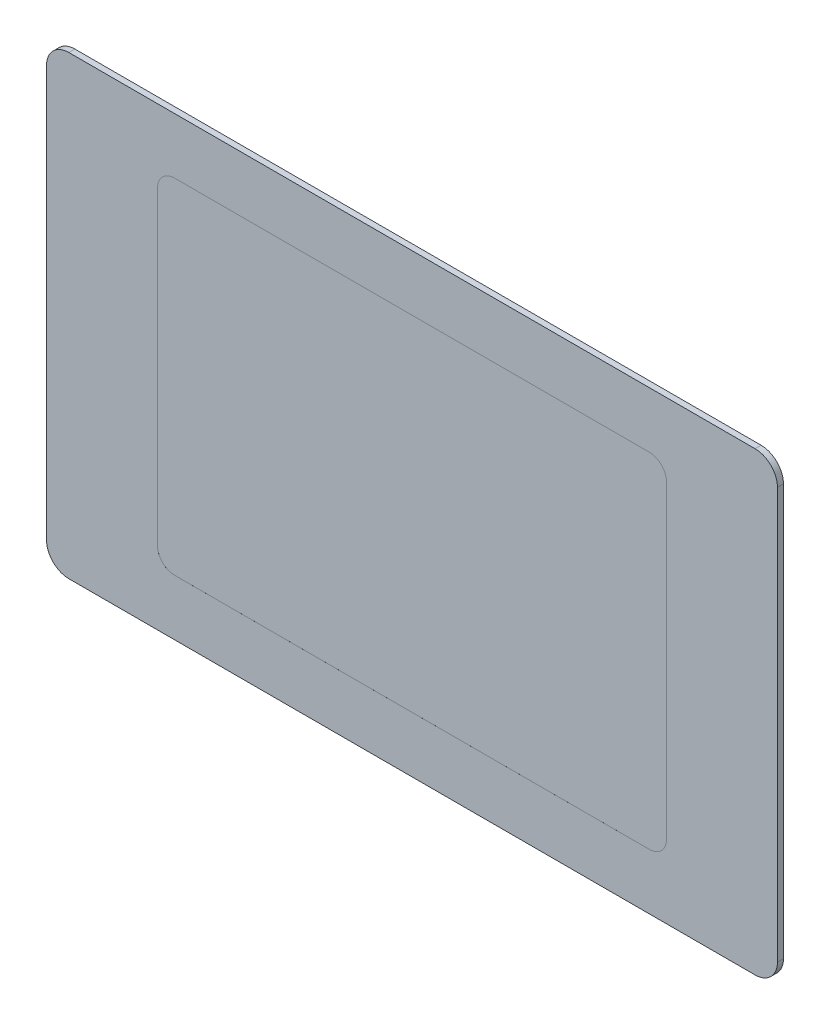
ISO-10303-21;
HEADER;
FILE_DESCRIPTION(('STEP AP214'),'2;1');
FILE_NAME('part.step','',(''),(''),'','','');
FILE_SCHEMA(('AUTOMOTIVE_DESIGN { 1 0 10303 214 1 1 1 1 }'));
ENDSEC;
DATA;
#1=APPLICATION_CONTEXT('core data for automotive mechanical design processes');
#2=APPLICATION_PROTOCOL_DEFINITION('international standard','automotive_design',2000,#1);
#3=PRODUCT_CONTEXT('',#1,'mechanical');
#4=PRODUCT('Part','Part','',(#3));
#5=PRODUCT_RELATED_PRODUCT_CATEGORY('part','',(#4));
#6=PRODUCT_DEFINITION_FORMATION('','',#4);
#7=PRODUCT_DEFINITION_CONTEXT('part definition',#1,'design');
#8=PRODUCT_DEFINITION('design','',#6,#7);
#9=PRODUCT_DEFINITION_SHAPE('','',#8);
#10=(LENGTH_UNIT() NAMED_UNIT(*) SI_UNIT(.MILLI.,.METRE.));
#11=(NAMED_UNIT(*) PLANE_ANGLE_UNIT() SI_UNIT($,.RADIAN.));
#12=(NAMED_UNIT(*) SI_UNIT($,.STERADIAN.) SOLID_ANGLE_UNIT());
#13=UNCERTAINTY_MEASURE_WITH_UNIT(LENGTH_MEASURE(1.E-05),#10,'distance_accuracy_value','');
#14=(GEOMETRIC_REPRESENTATION_CONTEXT(3) GLOBAL_UNCERTAINTY_ASSIGNED_CONTEXT((#13)) GLOBAL_UNIT_ASSIGNED_CONTEXT((#10,
#11,#12)) REPRESENTATION_CONTEXT('',''));
#15=CARTESIAN_POINT('',(0.,0.,0.));
#16=DIRECTION('',(0.,0.,1.));
#17=DIRECTION('',(1.,0.,0.));
#18=AXIS2_PLACEMENT_3D('',#15,#16,#17);
#19=CARTESIAN_POINT('',(-39.9,23.9,0.7));
#20=DIRECTION('',(0.,0.,-1.));
#21=DIRECTION('',(-1.,0.,0.));
#22=AXIS2_PLACEMENT_3D('',#19,#20,#21);
#23=CYLINDRICAL_SURFACE('',#22,2.6);
#24=CARTESIAN_POINT('',(-39.9,23.9,0.));
#25=DIRECTION('',(0.,0.,1.));
#26=DIRECTION('',(1.,0.,0.));
#27=AXIS2_PLACEMENT_3D('',#24,#25,#26);
#28=CIRCLE('',#27,2.6);
#29=CARTESIAN_POINT('',(-39.9,26.5,0.));
#30=VERTEX_POINT('',#29);
#31=CARTESIAN_POINT('',(-42.5,23.9,0.));
#32=VERTEX_POINT('',#31);
#33=EDGE_CURVE('E239',#30,#32,#28,.T.);
#34=ORIENTED_EDGE('',*,*,#33,.T.);
#35=DIRECTION('',(0.,0.,-1.));
#36=VECTOR('',#35,1.);
#37=CARTESIAN_POINT('',(-42.5,23.9,0.7));
#38=LINE('',#37,#36);
#39=CARTESIAN_POINT('',(-42.5,23.9,0.701));
#40=VERTEX_POINT('',#39);
#41=EDGE_CURVE('E11',#40,#32,#38,.T.);
#42=ORIENTED_EDGE('',*,*,#41,.F.);
#43=CARTESIAN_POINT('',(-39.9,23.9,0.701));
#44=DIRECTION('',(0.,0.,1.));
#45=DIRECTION('',(-1.,0.,0.));
#46=AXIS2_PLACEMENT_3D('',#43,#44,#45);
#47=CIRCLE('',#46,2.60000000000002);
#48=CARTESIAN_POINT('',(-39.9,26.5,0.701));
#49=VERTEX_POINT('',#48);
#50=EDGE_CURVE('E233',#49,#40,#47,.T.);
#51=ORIENTED_EDGE('',*,*,#50,.F.);
#52=DIRECTION('',(0.,0.,-1.));
#53=VECTOR('',#52,1.);
#54=CARTESIAN_POINT('',(-39.9,26.5,0.7));
#55=LINE('',#54,#53);
#56=EDGE_CURVE('E256',#49,#30,#55,.T.);
#57=ORIENTED_EDGE('',*,*,#56,.T.);
#58=EDGE_LOOP('',(#34,#42,#51,#57));
#59=FACE_BOUND('',#58,.T.);
#60=ADVANCED_FACE('F39',(#59),#23,.T.);
#61=CARTESIAN_POINT('',(-42.5,23.9,0.7));
#62=DIRECTION('',(1.,0.,0.));
#63=DIRECTION('',(0.,0.,-1.));
#64=AXIS2_PLACEMENT_3D('',#61,#62,#63);
#65=PLANE('',#64);
#66=DIRECTION('',(0.,-1.,0.));
#67=VECTOR('',#66,1.);
#68=CARTESIAN_POINT('',(-42.5,23.9,0.));
#69=LINE('',#68,#67);
#70=CARTESIAN_POINT('',(-42.5,-23.9,0.));
#71=VERTEX_POINT('',#70);
#72=EDGE_CURVE('E242',#32,#71,#69,.T.);
#73=ORIENTED_EDGE('',*,*,#72,.T.);
#74=DIRECTION('',(0.,0.,-1.));
#75=VECTOR('',#74,1.);
#76=CARTESIAN_POINT('',(-42.5,-23.9,0.7));
#77=LINE('',#76,#75);
#78=CARTESIAN_POINT('',(-42.5,-23.9,0.701));
#79=VERTEX_POINT('',#78);
#80=EDGE_CURVE('E46',#79,#71,#77,.T.);
#81=ORIENTED_EDGE('',*,*,#80,.F.);
#82=DIRECTION('',(0.,-1.,0.));
#83=VECTOR('',#82,1.);
#84=CARTESIAN_POINT('',(-42.5,-23.9,0.701));
#85=LINE('',#84,#83);
#86=EDGE_CURVE('E236',#40,#79,#85,.T.);
#87=ORIENTED_EDGE('',*,*,#86,.F.);
#88=ORIENTED_EDGE('',*,*,#41,.T.);
#89=EDGE_LOOP('',(#73,#81,#87,#88));
#90=FACE_BOUND('',#89,.T.);
#91=ADVANCED_FACE('F306',(#90),#65,.F.);
#92=CARTESIAN_POINT('',(-39.9,-23.9,0.7));
#93=DIRECTION('',(0.,0.,-1.));
#94=DIRECTION('',(-1.,0.,0.));
#95=AXIS2_PLACEMENT_3D('',#92,#93,#94);
#96=CYLINDRICAL_SURFACE('',#95,2.6);
#97=CARTESIAN_POINT('',(-39.9,-23.9,0.));
#98=DIRECTION('',(0.,0.,1.));
#99=DIRECTION('',(1.,0.,0.));
#100=AXIS2_PLACEMENT_3D('',#97,#98,#99);
#101=CIRCLE('',#100,2.6);
#102=CARTESIAN_POINT('',(-39.9,-26.5,0.));
#103=VERTEX_POINT('',#102);
#104=EDGE_CURVE('E244',#71,#103,#101,.T.);
#105=ORIENTED_EDGE('',*,*,#104,.T.);
#106=DIRECTION('',(0.,0.,-1.));
#107=VECTOR('',#106,1.);
#108=CARTESIAN_POINT('',(-39.9,-26.5,0.7));
#109=LINE('',#108,#107);
#110=CARTESIAN_POINT('',(-39.9,-26.5,0.701));
#111=VERTEX_POINT('',#110);
#112=EDGE_CURVE('E271',#111,#103,#109,.T.);
#113=ORIENTED_EDGE('',*,*,#112,.F.);
#114=CARTESIAN_POINT('',(-39.9,-23.9,0.701));
#115=DIRECTION('',(0.,0.,1.));
#116=DIRECTION('',(-1.,0.,0.));
#117=AXIS2_PLACEMENT_3D('',#114,#115,#116);
#118=CIRCLE('',#117,2.60000000000002);
#119=EDGE_CURVE('E165',#79,#111,#118,.T.);
#120=ORIENTED_EDGE('',*,*,#119,.F.);
#121=ORIENTED_EDGE('',*,*,#80,.T.);
#122=EDGE_LOOP('',(#105,#113,#120,#121));
#123=FACE_BOUND('',#122,.T.);
#124=ADVANCED_FACE('F277',(#123),#96,.T.);
#125=CARTESIAN_POINT('',(-39.9,-26.5,0.7));
#126=DIRECTION('',(0.,1.,0.));
#127=DIRECTION('',(0.,0.,1.));
#128=AXIS2_PLACEMENT_3D('',#125,#126,#127);
#129=PLANE('',#128);
#130=DIRECTION('',(1.,0.,0.));
#131=VECTOR('',#130,1.);
#132=CARTESIAN_POINT('',(-39.9,-26.5,0.));
#133=LINE('',#132,#131);
#134=CARTESIAN_POINT('',(39.9,-26.5,0.));
#135=VERTEX_POINT('',#134);
#136=EDGE_CURVE('E246',#103,#135,#133,.T.);
#137=ORIENTED_EDGE('',*,*,#136,.T.);
#138=DIRECTION('',(0.,0.,-1.));
#139=VECTOR('',#138,1.);
#140=CARTESIAN_POINT('',(39.9,-26.5,0.7));
#141=LINE('',#140,#139);
#142=CARTESIAN_POINT('',(39.9,-26.5,0.701));
#143=VERTEX_POINT('',#142);
#144=EDGE_CURVE('E268',#143,#135,#141,.T.);
#145=ORIENTED_EDGE('',*,*,#144,.F.);
#146=DIRECTION('',(1.,0.,0.));
#147=VECTOR('',#146,1.);
#148=CARTESIAN_POINT('',(39.9,-26.5,0.701));
#149=LINE('',#148,#147);
#150=EDGE_CURVE('E218',#111,#143,#149,.T.);
#151=ORIENTED_EDGE('',*,*,#150,.F.);
#152=ORIENTED_EDGE('',*,*,#112,.T.);
#153=EDGE_LOOP('',(#137,#145,#151,#152));
#154=FACE_BOUND('',#153,.T.);
#155=ADVANCED_FACE('F287',(#154),#129,.F.);
#156=CARTESIAN_POINT('',(39.9,-23.9,0.7));
#157=DIRECTION('',(0.,0.,-1.));
#158=DIRECTION('',(-1.,0.,0.));
#159=AXIS2_PLACEMENT_3D('',#156,#157,#158);
#160=CYLINDRICAL_SURFACE('',#159,2.6);
#161=CARTESIAN_POINT('',(39.9,-23.9,0.));
#162=DIRECTION('',(0.,0.,1.));
#163=DIRECTION('',(1.,0.,0.));
#164=AXIS2_PLACEMENT_3D('',#161,#162,#163);
#165=CIRCLE('',#164,2.6);
#166=CARTESIAN_POINT('',(42.5,-23.9,0.));
#167=VERTEX_POINT('',#166);
#168=EDGE_CURVE('E248',#135,#167,#165,.T.);
#169=ORIENTED_EDGE('',*,*,#168,.T.);
#170=DIRECTION('',(0.,0.,-1.));
#171=VECTOR('',#170,1.);
#172=CARTESIAN_POINT('',(42.5,-23.9,0.7));
#173=LINE('',#172,#171);
#174=CARTESIAN_POINT('',(42.5,-23.9,0.701));
#175=VERTEX_POINT('',#174);
#176=EDGE_CURVE('E265',#175,#167,#173,.T.);
#177=ORIENTED_EDGE('',*,*,#176,.F.);
#178=CARTESIAN_POINT('',(39.9,-23.9,0.701));
#179=DIRECTION('',(0.,0.,1.));
#180=DIRECTION('',(-1.,0.,0.));
#181=AXIS2_PLACEMENT_3D('',#178,#179,#180);
#182=CIRCLE('',#181,2.60000000000002);
#183=EDGE_CURVE('E221',#143,#175,#182,.T.);
#184=ORIENTED_EDGE('',*,*,#183,.F.);
#185=ORIENTED_EDGE('',*,*,#144,.T.);
#186=EDGE_LOOP('',(#169,#177,#184,#185));
#187=FACE_BOUND('',#186,.T.);
#188=ADVANCED_FACE('F291',(#187),#160,.T.);
#189=CARTESIAN_POINT('',(42.5,23.9,0.7));
#190=DIRECTION('',(-1.,0.,0.));
#191=DIRECTION('',(0.,0.,1.));
#192=AXIS2_PLACEMENT_3D('',#189,#190,#191);
#193=PLANE('',#192);
#194=DIRECTION('',(0.,1.,0.));
#195=VECTOR('',#194,1.);
#196=CARTESIAN_POINT('',(42.5,23.9,0.));
#197=LINE('',#196,#195);
#198=CARTESIAN_POINT('',(42.5,23.9,0.));
#199=VERTEX_POINT('',#198);
#200=EDGE_CURVE('E250',#167,#199,#197,.T.);
#201=ORIENTED_EDGE('',*,*,#200,.T.);
#202=DIRECTION('',(0.,0.,-1.));
#203=VECTOR('',#202,1.);
#204=CARTESIAN_POINT('',(42.5,23.9,0.7));
#205=LINE('',#204,#203);
#206=CARTESIAN_POINT('',(42.5,23.9,0.701));
#207=VERTEX_POINT('',#206);
#208=EDGE_CURVE('E262',#207,#199,#205,.T.);
#209=ORIENTED_EDGE('',*,*,#208,.F.);
#210=DIRECTION('',(0.,1.,0.));
#211=VECTOR('',#210,1.);
#212=CARTESIAN_POINT('',(42.5,23.9,0.701));
#213=LINE('',#212,#211);
#214=EDGE_CURVE('E224',#175,#207,#213,.T.);
#215=ORIENTED_EDGE('',*,*,#214,.F.);
#216=ORIENTED_EDGE('',*,*,#176,.T.);
#217=EDGE_LOOP('',(#201,#209,#215,#216));
#218=FACE_BOUND('',#217,.T.);
#219=ADVANCED_FACE('F296',(#218),#193,.F.);
#220=CARTESIAN_POINT('',(39.9,23.9,0.7));
#221=DIRECTION('',(0.,0.,-1.));
#222=DIRECTION('',(-1.,0.,0.));
#223=AXIS2_PLACEMENT_3D('',#220,#221,#222);
#224=CYLINDRICAL_SURFACE('',#223,2.6);
#225=CARTESIAN_POINT('',(39.9,23.9,0.));
#226=DIRECTION('',(0.,0.,1.));
#227=DIRECTION('',(-1.,0.,0.));
#228=AXIS2_PLACEMENT_3D('',#225,#226,#227);
#229=CIRCLE('',#228,2.6);
#230=CARTESIAN_POINT('',(39.9,26.5,0.));
#231=VERTEX_POINT('',#230);
#232=EDGE_CURVE('E252',#199,#231,#229,.T.);
#233=ORIENTED_EDGE('',*,*,#232,.T.);
#234=DIRECTION('',(0.,0.,-1.));
#235=VECTOR('',#234,1.);
#236=CARTESIAN_POINT('',(39.9,26.5,0.7));
#237=LINE('',#236,#235);
#238=CARTESIAN_POINT('',(39.9,26.5,0.701));
#239=VERTEX_POINT('',#238);
#240=EDGE_CURVE('E259',#239,#231,#237,.T.);
#241=ORIENTED_EDGE('',*,*,#240,.F.);
#242=CARTESIAN_POINT('',(39.9,23.9,0.701));
#243=DIRECTION('',(0.,0.,1.));
#244=DIRECTION('',(1.,0.,0.));
#245=AXIS2_PLACEMENT_3D('',#242,#243,#244);
#246=CIRCLE('',#245,2.60000000000002);
#247=EDGE_CURVE('E227',#207,#239,#246,.T.);
#248=ORIENTED_EDGE('',*,*,#247,.F.);
#249=ORIENTED_EDGE('',*,*,#208,.T.);
#250=EDGE_LOOP('',(#233,#241,#248,#249));
#251=FACE_BOUND('',#250,.T.);
#252=ADVANCED_FACE('F299',(#251),#224,.T.);
#253=CARTESIAN_POINT('',(-39.9,26.5,0.7));
#254=DIRECTION('',(0.,-1.,0.));
#255=DIRECTION('',(0.,0.,-1.));
#256=AXIS2_PLACEMENT_3D('',#253,#254,#255);
#257=PLANE('',#256);
#258=DIRECTION('',(-1.,0.,0.));
#259=VECTOR('',#258,1.);
#260=CARTESIAN_POINT('',(-39.9,26.5,0.));
#261=LINE('',#260,#259);
#262=EDGE_CURVE('E254',#231,#30,#261,.T.);
#263=ORIENTED_EDGE('',*,*,#262,.T.);
#264=ORIENTED_EDGE('',*,*,#56,.F.);
#265=DIRECTION('',(-1.,0.,0.));
#266=VECTOR('',#265,1.);
#267=CARTESIAN_POINT('',(-39.9,26.5,0.701));
#268=LINE('',#267,#266);
#269=EDGE_CURVE('E230',#239,#49,#268,.T.);
#270=ORIENTED_EDGE('',*,*,#269,.F.);
#271=ORIENTED_EDGE('',*,*,#240,.T.);
#272=EDGE_LOOP('',(#263,#264,#270,#271));
#273=FACE_BOUND('',#272,.T.);
#274=ADVANCED_FACE('F302',(#273),#257,.F.);
#275=CARTESIAN_POINT('',(-39.9,23.9,0.));
#276=DIRECTION('',(0.,0.,1.));
#277=DIRECTION('',(1.,0.,0.));
#278=AXIS2_PLACEMENT_3D('',#275,#276,#277);
#279=PLANE('',#278);
#280=ORIENTED_EDGE('',*,*,#33,.F.);
#281=ORIENTED_EDGE('',*,*,#262,.F.);
#282=ORIENTED_EDGE('',*,*,#232,.F.);
#283=ORIENTED_EDGE('',*,*,#200,.F.);
#284=ORIENTED_EDGE('',*,*,#168,.F.);
#285=ORIENTED_EDGE('',*,*,#136,.F.);
#286=ORIENTED_EDGE('',*,*,#104,.F.);
#287=ORIENTED_EDGE('',*,*,#72,.F.);
#288=EDGE_LOOP('',(#280,#281,#282,#283,#284,#285,#286,#287));
#289=FACE_BOUND('',#288,.T.);
#290=ADVANCED_FACE('F283',(#289),#279,.F.);
#291=CARTESIAN_POINT('',(-39.9,-23.9,0.701));
#292=DIRECTION('',(0.,0.,-1.));
#293=DIRECTION('',(-1.,0.,0.));
#294=AXIS2_PLACEMENT_3D('',#291,#292,#293);
#295=PLANE('',#294);
#296=ORIENTED_EDGE('',*,*,#119,.T.);
#297=ORIENTED_EDGE('',*,*,#150,.T.);
#298=ORIENTED_EDGE('',*,*,#183,.T.);
#299=ORIENTED_EDGE('',*,*,#214,.T.);
#300=ORIENTED_EDGE('',*,*,#247,.T.);
#301=ORIENTED_EDGE('',*,*,#269,.T.);
#302=ORIENTED_EDGE('',*,*,#50,.T.);
#303=ORIENTED_EDGE('',*,*,#86,.T.);
#304=EDGE_LOOP('',(#296,#297,#298,#299,#300,#301,#302,#303));
#305=FACE_BOUND('',#304,.T.);
#306=CARTESIAN_POINT('',(-27.6,-18.,0.701));
#307=DIRECTION('',(0.,0.,1.));
#308=DIRECTION('',(1.,0.,0.));
#309=AXIS2_PLACEMENT_3D('',#306,#307,#308);
#310=CIRCLE('',#309,2.);
#311=CARTESIAN_POINT('',(-29.6,-18.,0.701));
#312=VERTEX_POINT('',#311);
#313=CARTESIAN_POINT('',(-27.6,-20.,0.701));
#314=VERTEX_POINT('',#313);
#315=EDGE_CURVE('E150',#312,#314,#310,.T.);
#316=ORIENTED_EDGE('',*,*,#315,.F.);
#317=DIRECTION('',(0.,-1.,0.));
#318=VECTOR('',#317,1.);
#319=CARTESIAN_POINT('',(-29.6,18.,0.701));
#320=LINE('',#319,#318);
#321=CARTESIAN_POINT('',(-29.6,18.,0.701));
#322=VERTEX_POINT('',#321);
#323=EDGE_CURVE('E184',#322,#312,#320,.T.);
#324=ORIENTED_EDGE('',*,*,#323,.F.);
#325=CARTESIAN_POINT('',(-27.6,18.,0.701));
#326=DIRECTION('',(0.,0.,1.));
#327=DIRECTION('',(1.,0.,0.));
#328=AXIS2_PLACEMENT_3D('',#325,#326,#327);
#329=CIRCLE('',#328,2.);
#330=CARTESIAN_POINT('',(-27.6,20.,0.701));
#331=VERTEX_POINT('',#330);
#332=EDGE_CURVE('E181',#331,#322,#329,.T.);
#333=ORIENTED_EDGE('',*,*,#332,.F.);
#334=DIRECTION('',(-1.,0.,0.));
#335=VECTOR('',#334,1.);
#336=CARTESIAN_POINT('',(-27.6,20.,0.701));
#337=LINE('',#336,#335);
#338=CARTESIAN_POINT('',(27.6,20.,0.701));
#339=VERTEX_POINT('',#338);
#340=EDGE_CURVE('E179',#339,#331,#337,.T.);
#341=ORIENTED_EDGE('',*,*,#340,.F.);
#342=CARTESIAN_POINT('',(27.6,18.,0.701));
#343=DIRECTION('',(0.,0.,1.));
#344=DIRECTION('',(-1.,0.,0.));
#345=AXIS2_PLACEMENT_3D('',#342,#343,#344);
#346=CIRCLE('',#345,2.);
#347=CARTESIAN_POINT('',(29.6,18.,0.701));
#348=VERTEX_POINT('',#347);
#349=EDGE_CURVE('E177',#348,#339,#346,.T.);
#350=ORIENTED_EDGE('',*,*,#349,.F.);
#351=DIRECTION('',(0.,1.,0.));
#352=VECTOR('',#351,1.);
#353=CARTESIAN_POINT('',(29.6,18.,0.701));
#354=LINE('',#353,#352);
#355=CARTESIAN_POINT('',(29.6,-18.,0.701));
#356=VERTEX_POINT('',#355);
#357=EDGE_CURVE('E173',#356,#348,#354,.T.);
#358=ORIENTED_EDGE('',*,*,#357,.F.);
#359=CARTESIAN_POINT('',(27.6,-18.,0.701));
#360=DIRECTION('',(0.,0.,1.));
#361=DIRECTION('',(1.,0.,0.));
#362=AXIS2_PLACEMENT_3D('',#359,#360,#361);
#363=CIRCLE('',#362,2.);
#364=CARTESIAN_POINT('',(27.6,-20.,0.701));
#365=VERTEX_POINT('',#364);
#366=EDGE_CURVE('E171',#365,#356,#363,.T.);
#367=ORIENTED_EDGE('',*,*,#366,.F.);
#368=DIRECTION('',(1.,0.,0.));
#369=VECTOR('',#368,1.);
#370=CARTESIAN_POINT('',(-27.6,-20.,0.701));
#371=LINE('',#370,#369);
#372=EDGE_CURVE('E159',#314,#365,#371,.T.);
#373=ORIENTED_EDGE('',*,*,#372,.F.);
#374=EDGE_LOOP('',(#316,#324,#333,#341,#350,#358,#367,#373));
#375=FACE_BOUND('',#374,.T.);
#376=ADVANCED_FACE('F169',(#305,#375),#295,.F.);
#377=CARTESIAN_POINT('',(-27.6,-18.,0.701));
#378=DIRECTION('',(0.,0.,-1.));
#379=DIRECTION('',(-1.,0.,0.));
#380=AXIS2_PLACEMENT_3D('',#377,#378,#379);
#381=CYLINDRICAL_SURFACE('',#380,2.);
#382=CARTESIAN_POINT('',(-27.6,-18.,0.7));
#383=DIRECTION('',(0.,0.,1.));
#384=DIRECTION('',(1.,0.,0.));
#385=AXIS2_PLACEMENT_3D('',#382,#383,#384);
#386=CIRCLE('',#385,2.);
#387=CARTESIAN_POINT('',(-29.6,-18.,0.7));
#388=VERTEX_POINT('',#387);
#389=CARTESIAN_POINT('',(-27.6,-20.,0.7));
#390=VERTEX_POINT('',#389);
#391=EDGE_CURVE('E53',#388,#390,#386,.T.);
#392=ORIENTED_EDGE('',*,*,#391,.F.);
#393=DIRECTION('',(0.,0.,-1.));
#394=VECTOR('',#393,1.);
#395=CARTESIAN_POINT('',(-29.6,-18.,0.701));
#396=LINE('',#395,#394);
#397=EDGE_CURVE('E155',#312,#388,#396,.T.);
#398=ORIENTED_EDGE('',*,*,#397,.F.);
#399=ORIENTED_EDGE('',*,*,#315,.T.);
#400=DIRECTION('',(0.,0.,-1.));
#401=VECTOR('',#400,1.);
#402=CARTESIAN_POINT('',(-27.6,-20.,0.701));
#403=LINE('',#402,#401);
#404=EDGE_CURVE('E153',#314,#390,#403,.T.);
#405=ORIENTED_EDGE('',*,*,#404,.T.);
#406=EDGE_LOOP('',(#392,#398,#399,#405));
#407=FACE_BOUND('',#406,.T.);
#408=ADVANCED_FACE('F152',(#407),#381,.F.);
#409=CARTESIAN_POINT('',(-27.6,-20.,0.701));
#410=DIRECTION('',(0.,1.,0.));
#411=DIRECTION('',(0.,0.,1.));
#412=AXIS2_PLACEMENT_3D('',#409,#410,#411);
#413=PLANE('',#412);
#414=DIRECTION('',(1.,0.,0.));
#415=VECTOR('',#414,1.);
#416=CARTESIAN_POINT('',(-27.6,-20.,0.7));
#417=LINE('',#416,#415);
#418=CARTESIAN_POINT('',(27.6,-20.,0.7));
#419=VERTEX_POINT('',#418);
#420=EDGE_CURVE('E57',#390,#419,#417,.T.);
#421=ORIENTED_EDGE('',*,*,#420,.F.);
#422=ORIENTED_EDGE('',*,*,#404,.F.);
#423=ORIENTED_EDGE('',*,*,#372,.T.);
#424=DIRECTION('',(0.,0.,-1.));
#425=VECTOR('',#424,1.);
#426=CARTESIAN_POINT('',(27.6,-20.,0.701));
#427=LINE('',#426,#425);
#428=EDGE_CURVE('E166',#365,#419,#427,.T.);
#429=ORIENTED_EDGE('',*,*,#428,.T.);
#430=EDGE_LOOP('',(#421,#422,#423,#429));
#431=FACE_BOUND('',#430,.T.);
#432=ADVANCED_FACE('F163',(#431),#413,.T.);
#433=CARTESIAN_POINT('',(27.6,-18.,0.701));
#434=DIRECTION('',(0.,0.,-1.));
#435=DIRECTION('',(-1.,0.,0.));
#436=AXIS2_PLACEMENT_3D('',#433,#434,#435);
#437=CYLINDRICAL_SURFACE('',#436,2.);
#438=CARTESIAN_POINT('',(27.6,-18.,0.7));
#439=DIRECTION('',(0.,0.,1.));
#440=DIRECTION('',(1.,0.,0.));
#441=AXIS2_PLACEMENT_3D('',#438,#439,#440);
#442=CIRCLE('',#441,2.);
#443=CARTESIAN_POINT('',(29.6,-18.,0.7));
#444=VERTEX_POINT('',#443);
#445=EDGE_CURVE('E188',#419,#444,#442,.T.);
#446=ORIENTED_EDGE('',*,*,#445,.F.);
#447=ORIENTED_EDGE('',*,*,#428,.F.);
#448=ORIENTED_EDGE('',*,*,#366,.T.);
#449=DIRECTION('',(0.,0.,-1.));
#450=VECTOR('',#449,1.);
#451=CARTESIAN_POINT('',(29.6,-18.,0.701));
#452=LINE('',#451,#450);
#453=EDGE_CURVE('E212',#356,#444,#452,.T.);
#454=ORIENTED_EDGE('',*,*,#453,.T.);
#455=EDGE_LOOP('',(#446,#447,#448,#454));
#456=FACE_BOUND('',#455,.T.);
#457=ADVANCED_FACE('F336',(#456),#437,.F.);
#458=CARTESIAN_POINT('',(29.6,18.,0.701));
#459=DIRECTION('',(-1.,0.,0.));
#460=DIRECTION('',(0.,0.,1.));
#461=AXIS2_PLACEMENT_3D('',#458,#459,#460);
#462=PLANE('',#461);
#463=DIRECTION('',(0.,1.,0.));
#464=VECTOR('',#463,1.);
#465=CARTESIAN_POINT('',(29.6,18.,0.7));
#466=LINE('',#465,#464);
#467=CARTESIAN_POINT('',(29.6,18.,0.7));
#468=VERTEX_POINT('',#467);
#469=EDGE_CURVE('E190',#444,#468,#466,.T.);
#470=ORIENTED_EDGE('',*,*,#469,.F.);
#471=ORIENTED_EDGE('',*,*,#453,.F.);
#472=ORIENTED_EDGE('',*,*,#357,.T.);
#473=DIRECTION('',(0.,0.,-1.));
#474=VECTOR('',#473,1.);
#475=CARTESIAN_POINT('',(29.6,18.,0.701));
#476=LINE('',#475,#474);
#477=EDGE_CURVE('E209',#348,#468,#476,.T.);
#478=ORIENTED_EDGE('',*,*,#477,.T.);
#479=EDGE_LOOP('',(#470,#471,#472,#478));
#480=FACE_BOUND('',#479,.T.);
#481=ADVANCED_FACE('F339',(#480),#462,.T.);
#482=CARTESIAN_POINT('',(27.6,18.,0.701));
#483=DIRECTION('',(0.,0.,-1.));
#484=DIRECTION('',(-1.,0.,0.));
#485=AXIS2_PLACEMENT_3D('',#482,#483,#484);
#486=CYLINDRICAL_SURFACE('',#485,2.);
#487=CARTESIAN_POINT('',(27.6,18.,0.7));
#488=DIRECTION('',(0.,0.,1.));
#489=DIRECTION('',(-1.,0.,0.));
#490=AXIS2_PLACEMENT_3D('',#487,#488,#489);
#491=CIRCLE('',#490,2.);
#492=CARTESIAN_POINT('',(27.6,20.,0.7));
#493=VERTEX_POINT('',#492);
#494=EDGE_CURVE('E192',#468,#493,#491,.T.);
#495=ORIENTED_EDGE('',*,*,#494,.F.);
#496=ORIENTED_EDGE('',*,*,#477,.F.);
#497=ORIENTED_EDGE('',*,*,#349,.T.);
#498=DIRECTION('',(0.,0.,-1.));
#499=VECTOR('',#498,1.);
#500=CARTESIAN_POINT('',(27.6,20.,0.701));
#501=LINE('',#500,#499);
#502=EDGE_CURVE('E206',#339,#493,#501,.T.);
#503=ORIENTED_EDGE('',*,*,#502,.T.);
#504=EDGE_LOOP('',(#495,#496,#497,#503));
#505=FACE_BOUND('',#504,.T.);
#506=ADVANCED_FACE('F343',(#505),#486,.F.);
#507=CARTESIAN_POINT('',(-27.6,20.,0.701));
#508=DIRECTION('',(0.,-1.,0.));
#509=DIRECTION('',(0.,0.,-1.));
#510=AXIS2_PLACEMENT_3D('',#507,#508,#509);
#511=PLANE('',#510);
#512=DIRECTION('',(-1.,0.,0.));
#513=VECTOR('',#512,1.);
#514=CARTESIAN_POINT('',(-27.6,20.,0.7));
#515=LINE('',#514,#513);
#516=CARTESIAN_POINT('',(-27.6,20.,0.7));
#517=VERTEX_POINT('',#516);
#518=EDGE_CURVE('E194',#493,#517,#515,.T.);
#519=ORIENTED_EDGE('',*,*,#518,.F.);
#520=ORIENTED_EDGE('',*,*,#502,.F.);
#521=ORIENTED_EDGE('',*,*,#340,.T.);
#522=DIRECTION('',(0.,0.,-1.));
#523=VECTOR('',#522,1.);
#524=CARTESIAN_POINT('',(-27.6,20.,0.701));
#525=LINE('',#524,#523);
#526=EDGE_CURVE('E203',#331,#517,#525,.T.);
#527=ORIENTED_EDGE('',*,*,#526,.T.);
#528=EDGE_LOOP('',(#519,#520,#521,#527));
#529=FACE_BOUND('',#528,.T.);
#530=ADVANCED_FACE('F347',(#529),#511,.T.);
#531=CARTESIAN_POINT('',(-27.6,18.,0.701));
#532=DIRECTION('',(0.,0.,-1.));
#533=DIRECTION('',(-1.,0.,0.));
#534=AXIS2_PLACEMENT_3D('',#531,#532,#533);
#535=CYLINDRICAL_SURFACE('',#534,2.);
#536=CARTESIAN_POINT('',(-27.6,18.,0.7));
#537=DIRECTION('',(0.,0.,1.));
#538=DIRECTION('',(1.,0.,0.));
#539=AXIS2_PLACEMENT_3D('',#536,#537,#538);
#540=CIRCLE('',#539,2.);
#541=CARTESIAN_POINT('',(-29.6,18.,0.7));
#542=VERTEX_POINT('',#541);
#543=EDGE_CURVE('E196',#517,#542,#540,.T.);
#544=ORIENTED_EDGE('',*,*,#543,.F.);
#545=ORIENTED_EDGE('',*,*,#526,.F.);
#546=ORIENTED_EDGE('',*,*,#332,.T.);
#547=DIRECTION('',(0.,0.,-1.));
#548=VECTOR('',#547,1.);
#549=CARTESIAN_POINT('',(-29.6,18.,0.701));
#550=LINE('',#549,#548);
#551=EDGE_CURVE('E200',#322,#542,#550,.T.);
#552=ORIENTED_EDGE('',*,*,#551,.T.);
#553=EDGE_LOOP('',(#544,#545,#546,#552));
#554=FACE_BOUND('',#553,.T.);
#555=ADVANCED_FACE('F351',(#554),#535,.F.);
#556=CARTESIAN_POINT('',(-29.6,18.,0.701));
#557=DIRECTION('',(1.,0.,0.));
#558=DIRECTION('',(0.,1.,0.));
#559=AXIS2_PLACEMENT_3D('',#556,#557,#558);
#560=PLANE('',#559);
#561=DIRECTION('',(0.,-1.,0.));
#562=VECTOR('',#561,1.);
#563=CARTESIAN_POINT('',(-29.6,18.,0.7));
#564=LINE('',#563,#562);
#565=EDGE_CURVE('E160',#542,#388,#564,.T.);
#566=ORIENTED_EDGE('',*,*,#565,.F.);
#567=ORIENTED_EDGE('',*,*,#551,.F.);
#568=ORIENTED_EDGE('',*,*,#323,.T.);
#569=ORIENTED_EDGE('',*,*,#397,.T.);
#570=EDGE_LOOP('',(#566,#567,#568,#569));
#571=FACE_BOUND('',#570,.T.);
#572=ADVANCED_FACE('F329',(#571),#560,.T.);
#573=CARTESIAN_POINT('',(-39.9,23.9,0.7));
#574=DIRECTION('',(0.,0.,1.));
#575=DIRECTION('',(1.,0.,0.));
#576=AXIS2_PLACEMENT_3D('',#573,#574,#575);
#577=PLANE('',#576);
#578=ORIENTED_EDGE('',*,*,#391,.T.);
#579=ORIENTED_EDGE('',*,*,#420,.T.);
#580=ORIENTED_EDGE('',*,*,#445,.T.);
#581=ORIENTED_EDGE('',*,*,#469,.T.);
#582=ORIENTED_EDGE('',*,*,#494,.T.);
#583=ORIENTED_EDGE('',*,*,#518,.T.);
#584=ORIENTED_EDGE('',*,*,#543,.T.);
#585=ORIENTED_EDGE('',*,*,#565,.T.);
#586=EDGE_LOOP('',(#578,#579,#580,#581,#582,#583,#584,#585));
#587=FACE_BOUND('',#586,.T.);
#588=ADVANCED_FACE('F326',(#587),#577,.T.);
#589=CLOSED_SHELL('',(#60,#91,#124,#155,#188,#219,#252,#274,#290,#376,#408,#432,#457,#481,#506,
#530,#555,#572,#588));
#590=MANIFOLD_SOLID_BREP('B2',#589);
#591=ADVANCED_BREP_SHAPE_REPRESENTATION('',(#18,#590),#14);
#592=SHAPE_DEFINITION_REPRESENTATION(#9,#591);
ENDSEC;
END-ISO-10303-21;
